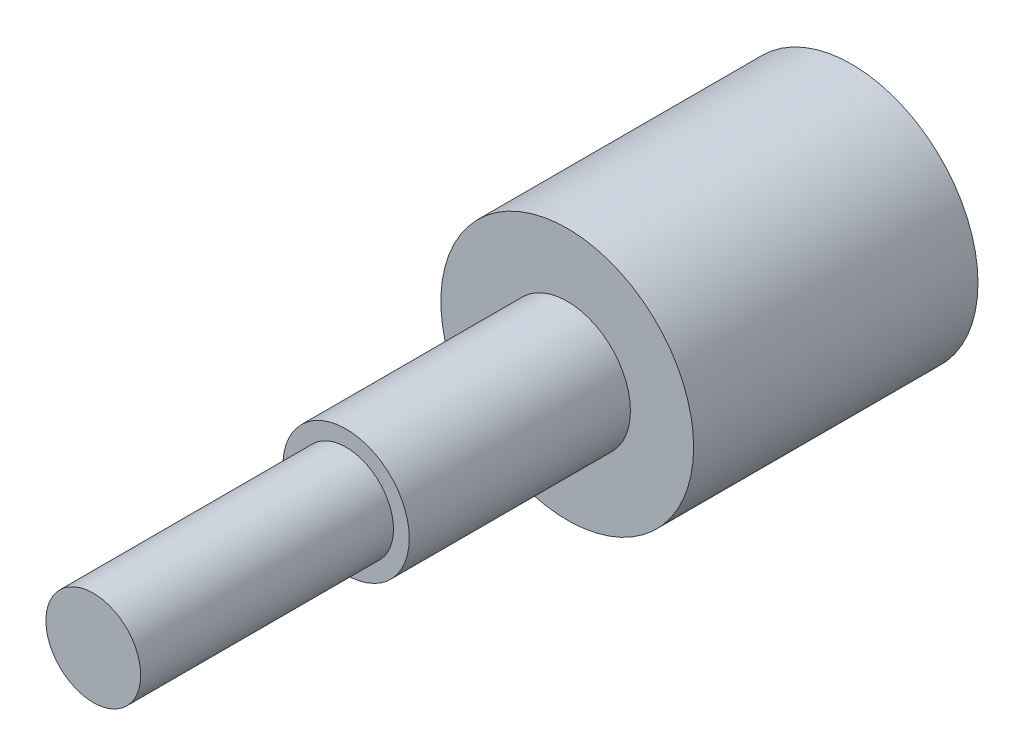
ISO-10303-21;
HEADER;
FILE_DESCRIPTION(('STEP AP214'),'2;1');
FILE_NAME('part.step','',(''),(''),'','','');
FILE_SCHEMA(('AUTOMOTIVE_DESIGN { 1 0 10303 214 1 1 1 1 }'));
ENDSEC;
DATA;
#1=APPLICATION_CONTEXT('core data for automotive mechanical design processes');
#2=APPLICATION_PROTOCOL_DEFINITION('international standard','automotive_design',2000,#1);
#3=PRODUCT_CONTEXT('',#1,'mechanical');
#4=PRODUCT('Part','Part','',(#3));
#5=PRODUCT_RELATED_PRODUCT_CATEGORY('part','',(#4));
#6=PRODUCT_DEFINITION_FORMATION('','',#4);
#7=PRODUCT_DEFINITION_CONTEXT('part definition',#1,'design');
#8=PRODUCT_DEFINITION('design','',#6,#7);
#9=PRODUCT_DEFINITION_SHAPE('','',#8);
#10=(LENGTH_UNIT() NAMED_UNIT(*) SI_UNIT(.MILLI.,.METRE.));
#11=(NAMED_UNIT(*) PLANE_ANGLE_UNIT() SI_UNIT($,.RADIAN.));
#12=(NAMED_UNIT(*) SI_UNIT($,.STERADIAN.) SOLID_ANGLE_UNIT());
#13=UNCERTAINTY_MEASURE_WITH_UNIT(LENGTH_MEASURE(1.E-05),#10,'distance_accuracy_value','');
#14=(GEOMETRIC_REPRESENTATION_CONTEXT(3) GLOBAL_UNCERTAINTY_ASSIGNED_CONTEXT((#13)) GLOBAL_UNIT_ASSIGNED_CONTEXT((#10,
#11,#12)) REPRESENTATION_CONTEXT('',''));
#15=CARTESIAN_POINT('',(0.,0.,0.));
#16=DIRECTION('',(0.,0.,1.));
#17=DIRECTION('',(1.,0.,0.));
#18=AXIS2_PLACEMENT_3D('',#15,#16,#17);
#19=CARTESIAN_POINT('',(0.,0.,9.));
#20=DIRECTION('',(0.,0.,-1.));
#21=DIRECTION('',(-1.,0.,0.));
#22=AXIS2_PLACEMENT_3D('',#19,#20,#21);
#23=CYLINDRICAL_SURFACE('',#22,4.);
#24=CARTESIAN_POINT('',(0.,0.,9.));
#25=DIRECTION('',(0.,0.,1.));
#26=DIRECTION('',(1.,0.,0.));
#27=AXIS2_PLACEMENT_3D('',#24,#25,#26);
#28=CIRCLE('',#27,4.);
#29=CARTESIAN_POINT('',(4.,0.,9.));
#30=VERTEX_POINT('',#29);
#31=EDGE_CURVE('E10',#30,#30,#28,.T.);
#32=ORIENTED_EDGE('',*,*,#31,.F.);
#33=EDGE_LOOP('',(#32));
#34=FACE_BOUND('',#33,.T.);
#35=CARTESIAN_POINT('',(0.,0.,0.));
#36=DIRECTION('',(0.,0.,1.));
#37=DIRECTION('',(1.,0.,0.));
#38=AXIS2_PLACEMENT_3D('',#35,#36,#37);
#39=CIRCLE('',#38,4.);
#40=CARTESIAN_POINT('',(4.,0.,0.));
#41=VERTEX_POINT('',#40);
#42=EDGE_CURVE('E33',#41,#41,#39,.T.);
#43=ORIENTED_EDGE('',*,*,#42,.T.);
#44=EDGE_LOOP('',(#43));
#45=FACE_BOUND('',#44,.T.);
#46=ADVANCED_FACE('F30',(#34,#45),#23,.T.);
#47=CARTESIAN_POINT('',(0.,0.,9.));
#48=DIRECTION('',(0.,0.,1.));
#49=DIRECTION('',(1.,0.,0.));
#50=AXIS2_PLACEMENT_3D('',#47,#48,#49);
#51=PLANE('',#50);
#52=CARTESIAN_POINT('',(0.,0.,9.));
#53=DIRECTION('',(0.,0.,1.));
#54=DIRECTION('',(1.,0.,0.));
#55=AXIS2_PLACEMENT_3D('',#52,#53,#54);
#56=CIRCLE('',#55,2.);
#57=CARTESIAN_POINT('',(2.,0.,9.));
#58=VERTEX_POINT('',#57);
#59=EDGE_CURVE('E42',#58,#58,#56,.T.);
#60=ORIENTED_EDGE('',*,*,#59,.F.);
#61=EDGE_LOOP('',(#60));
#62=FACE_BOUND('',#61,.T.);
#63=ORIENTED_EDGE('',*,*,#31,.T.);
#64=EDGE_LOOP('',(#63));
#65=FACE_BOUND('',#64,.T.);
#66=ADVANCED_FACE('F75',(#62,#65),#51,.T.);
#67=CARTESIAN_POINT('',(0.,0.,0.));
#68=DIRECTION('',(0.,0.,1.));
#69=DIRECTION('',(1.,0.,0.));
#70=AXIS2_PLACEMENT_3D('',#67,#68,#69);
#71=PLANE('',#70);
#72=ORIENTED_EDGE('',*,*,#42,.F.);
#73=EDGE_LOOP('',(#72));
#74=FACE_BOUND('',#73,.T.);
#75=ADVANCED_FACE('F71',(#74),#71,.F.);
#76=CARTESIAN_POINT('',(0.,0.,16.));
#77=DIRECTION('',(0.,0.,-1.));
#78=DIRECTION('',(-1.,0.,0.));
#79=AXIS2_PLACEMENT_3D('',#76,#77,#78);
#80=CYLINDRICAL_SURFACE('',#79,2.);
#81=CARTESIAN_POINT('',(0.,0.,16.));
#82=DIRECTION('',(0.,0.,1.));
#83=DIRECTION('',(1.,0.,0.));
#84=AXIS2_PLACEMENT_3D('',#81,#82,#83);
#85=CIRCLE('',#84,2.);
#86=CARTESIAN_POINT('',(2.,0.,16.));
#87=VERTEX_POINT('',#86);
#88=EDGE_CURVE('E40',#87,#87,#85,.T.);
#89=ORIENTED_EDGE('',*,*,#88,.F.);
#90=EDGE_LOOP('',(#89));
#91=FACE_BOUND('',#90,.T.);
#92=ORIENTED_EDGE('',*,*,#59,.T.);
#93=EDGE_LOOP('',(#92));
#94=FACE_BOUND('',#93,.T.);
#95=ADVANCED_FACE('F65',(#91,#94),#80,.T.);
#96=CARTESIAN_POINT('',(0.,0.,16.));
#97=DIRECTION('',(0.,0.,1.));
#98=DIRECTION('',(1.,0.,0.));
#99=AXIS2_PLACEMENT_3D('',#96,#97,#98);
#100=PLANE('',#99);
#101=CARTESIAN_POINT('',(0.,0.,16.));
#102=DIRECTION('',(0.,0.,1.));
#103=DIRECTION('',(1.,0.,0.));
#104=AXIS2_PLACEMENT_3D('',#101,#102,#103);
#105=CIRCLE('',#104,1.5);
#106=CARTESIAN_POINT('',(1.5,0.,16.));
#107=VERTEX_POINT('',#106);
#108=EDGE_CURVE('E48',#107,#107,#105,.T.);
#109=ORIENTED_EDGE('',*,*,#108,.F.);
#110=EDGE_LOOP('',(#109));
#111=FACE_BOUND('',#110,.T.);
#112=ORIENTED_EDGE('',*,*,#88,.T.);
#113=EDGE_LOOP('',(#112));
#114=FACE_BOUND('',#113,.T.);
#115=ADVANCED_FACE('F59',(#111,#114),#100,.T.);
#116=CARTESIAN_POINT('',(0.,0.,24.));
#117=DIRECTION('',(0.,0.,-1.));
#118=DIRECTION('',(-1.,0.,0.));
#119=AXIS2_PLACEMENT_3D('',#116,#117,#118);
#120=CYLINDRICAL_SURFACE('',#119,1.5);
#121=CARTESIAN_POINT('',(0.,0.,24.));
#122=DIRECTION('',(0.,0.,1.));
#123=DIRECTION('',(1.,0.,0.));
#124=AXIS2_PLACEMENT_3D('',#121,#122,#123);
#125=CIRCLE('',#124,1.5);
#126=CARTESIAN_POINT('',(1.5,0.,24.));
#127=VERTEX_POINT('',#126);
#128=EDGE_CURVE('E45',#127,#127,#125,.T.);
#129=ORIENTED_EDGE('',*,*,#128,.F.);
#130=EDGE_LOOP('',(#129));
#131=FACE_BOUND('',#130,.T.);
#132=ORIENTED_EDGE('',*,*,#108,.T.);
#133=EDGE_LOOP('',(#132));
#134=FACE_BOUND('',#133,.T.);
#135=ADVANCED_FACE('F56',(#131,#134),#120,.T.);
#136=CARTESIAN_POINT('',(0.,0.,24.));
#137=DIRECTION('',(0.,0.,1.));
#138=DIRECTION('',(1.,0.,0.));
#139=AXIS2_PLACEMENT_3D('',#136,#137,#138);
#140=PLANE('',#139);
#141=ORIENTED_EDGE('',*,*,#128,.T.);
#142=EDGE_LOOP('',(#141));
#143=FACE_BOUND('',#142,.T.);
#144=ADVANCED_FACE('F54',(#143),#140,.T.);
#145=CLOSED_SHELL('',(#46,#66,#75,#95,#115,#135,#144));
#146=MANIFOLD_SOLID_BREP('B2',#145);
#147=ADVANCED_BREP_SHAPE_REPRESENTATION('',(#18,#146),#14);
#148=SHAPE_DEFINITION_REPRESENTATION(#9,#147);
ENDSEC;
END-ISO-10303-21;
